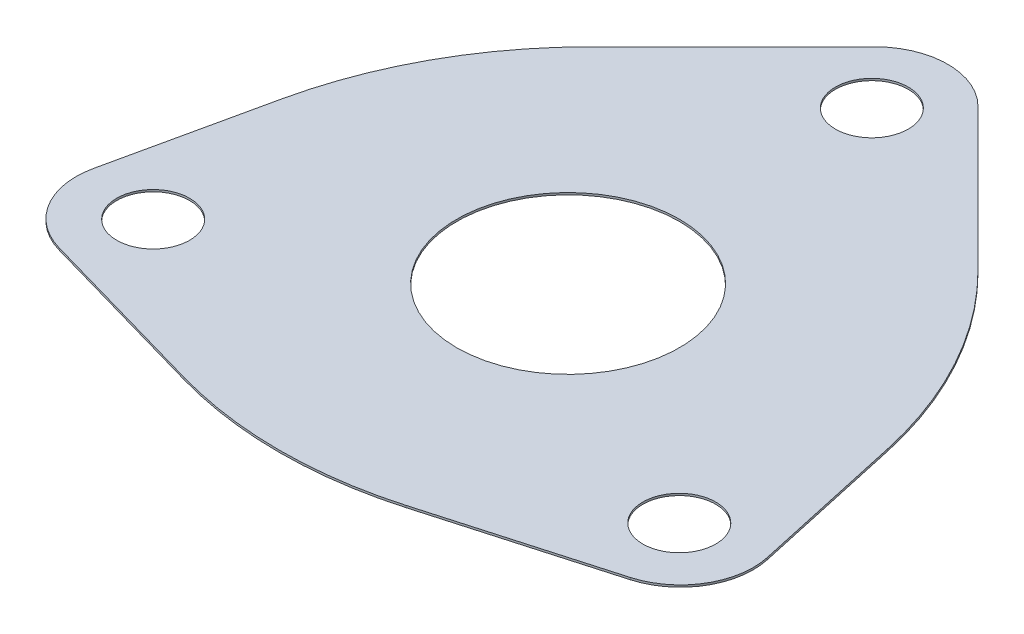
ISO-10303-21;
HEADER;
FILE_DESCRIPTION(('STEP AP214'),'2;1');
FILE_NAME('part.step','',(''),(''),'','','');
FILE_SCHEMA(('AUTOMOTIVE_DESIGN { 1 0 10303 214 1 1 1 1 }'));
ENDSEC;
DATA;
#1=APPLICATION_CONTEXT('core data for automotive mechanical design processes');
#2=APPLICATION_PROTOCOL_DEFINITION('international standard','automotive_design',2000,#1);
#3=PRODUCT_CONTEXT('',#1,'mechanical');
#4=PRODUCT('Part','Part','',(#3));
#5=PRODUCT_RELATED_PRODUCT_CATEGORY('part','',(#4));
#6=PRODUCT_DEFINITION_FORMATION('','',#4);
#7=PRODUCT_DEFINITION_CONTEXT('part definition',#1,'design');
#8=PRODUCT_DEFINITION('design','',#6,#7);
#9=PRODUCT_DEFINITION_SHAPE('','',#8);
#10=(LENGTH_UNIT() NAMED_UNIT(*) SI_UNIT(.MILLI.,.METRE.));
#11=(NAMED_UNIT(*) PLANE_ANGLE_UNIT() SI_UNIT($,.RADIAN.));
#12=(NAMED_UNIT(*) SI_UNIT($,.STERADIAN.) SOLID_ANGLE_UNIT());
#13=UNCERTAINTY_MEASURE_WITH_UNIT(LENGTH_MEASURE(1.E-05),#10,'distance_accuracy_value','');
#14=(GEOMETRIC_REPRESENTATION_CONTEXT(3) GLOBAL_UNCERTAINTY_ASSIGNED_CONTEXT((#13)) GLOBAL_UNIT_ASSIGNED_CONTEXT((#10,
#11,#12)) REPRESENTATION_CONTEXT('',''));
#15=CARTESIAN_POINT('',(0.,0.,0.));
#16=DIRECTION('',(0.,0.,1.));
#17=DIRECTION('',(1.,0.,0.));
#18=AXIS2_PLACEMENT_3D('',#15,#16,#17);
#19=CARTESIAN_POINT('',(0.,0.5,-75.7521943673232));
#20=DIRECTION('',(0.,1.,0.));
#21=DIRECTION('',(0.,0.,1.));
#22=AXIS2_PLACEMENT_3D('',#19,#20,#21);
#23=PLANE('',#22);
#24=CARTESIAN_POINT('',(0.,0.5,-75.));
#25=DIRECTION('',(0.,1.,0.));
#26=DIRECTION('',(0.,0.,1.));
#27=AXIS2_PLACEMENT_3D('',#24,#25,#26);
#28=CIRCLE('',#27,9.);
#29=CARTESIAN_POINT('',(0.,0.5,-66.));
#30=VERTEX_POINT('',#29);
#31=EDGE_CURVE('E298',#30,#30,#28,.T.);
#32=ORIENTED_EDGE('',*,*,#31,.F.);
#33=EDGE_LOOP('',(#32));
#34=FACE_BOUND('',#33,.T.);
#35=CARTESIAN_POINT('',(64.9519052838329,0.5,37.5));
#36=DIRECTION('',(0.,1.,0.));
#37=DIRECTION('',(0.,0.,1.));
#38=AXIS2_PLACEMENT_3D('',#35,#36,#37);
#39=CIRCLE('',#38,9.);
#40=CARTESIAN_POINT('',(64.9519052838329,0.5,46.5));
#41=VERTEX_POINT('',#40);
#42=EDGE_CURVE('E165',#41,#41,#39,.T.);
#43=ORIENTED_EDGE('',*,*,#42,.F.);
#44=EDGE_LOOP('',(#43));
#45=FACE_BOUND('',#44,.T.);
#46=CARTESIAN_POINT('',(0.,0.5,-75.7521943673232));
#47=DIRECTION('',(0.,1.,0.));
#48=DIRECTION('',(0.,0.,1.));
#49=AXIS2_PLACEMENT_3D('',#46,#47,#48);
#50=CIRCLE('',#49,18.);
#51=CARTESIAN_POINT('',(12.7279220613578,0.5,-88.4801164286811));
#52=VERTEX_POINT('',#51);
#53=CARTESIAN_POINT('',(-12.7279220613578,0.5,-88.4801164286811));
#54=VERTEX_POINT('',#53);
#55=EDGE_CURVE('E184',#52,#54,#50,.T.);
#56=ORIENTED_EDGE('',*,*,#55,.T.);
#57=DIRECTION('',(-0.707106781186548,0.,0.707106781186547));
#58=VECTOR('',#57,1.);
#59=CARTESIAN_POINT('',(-12.7279220613578,0.5,-88.4801164286811));
#60=LINE('',#59,#58);
#61=CARTESIAN_POINT('',(-47.8531523018058,0.5,-53.3548861882332));
#62=VERTEX_POINT('',#61);
#63=EDGE_CURVE('E112',#54,#62,#60,.T.);
#64=ORIENTED_EDGE('',*,*,#63,.T.);
#65=CARTESIAN_POINT('',(22.8575258168488,0.5,17.3557919304217));
#66=DIRECTION('',(0.,1.,0.));
#67=DIRECTION('',(0.,0.,-1.));
#68=AXIS2_PLACEMENT_3D('',#65,#66,#67);
#69=CIRCLE('',#68,100.);
#70=CARTESIAN_POINT('',(-74.8147469923264,0.5,-4.09478205467377));
#71=VERTEX_POINT('',#70);
#72=EDGE_CURVE('E211',#62,#71,#69,.T.);
#73=ORIENTED_EDGE('',*,*,#72,.T.);
#74=DIRECTION('',(-0.214505739850953,0.,0.976722728091752));
#75=VECTOR('',#74,1.);
#76=CARTESIAN_POINT('',(-83.1843338201699,0.5,34.0149938663444));
#77=LINE('',#76,#75);
#78=CARTESIAN_POINT('',(-83.1843338201699,0.5,34.0149938663444));
#79=VERTEX_POINT('',#78);
#80=EDGE_CURVE('E230',#71,#79,#77,.T.);
#81=ORIENTED_EDGE('',*,*,#80,.T.);
#82=CARTESIAN_POINT('',(-65.6033247145183,0.5,37.8760971836616));
#83=DIRECTION('',(0.,1.,0.));
#84=DIRECTION('',(0.,0.,1.));
#85=AXIS2_PLACEMENT_3D('',#82,#83,#84);
#86=CIRCLE('',#85,18.);
#87=CARTESIAN_POINT('',(-70.5339660250572,0.5,55.1876186727396));
#88=VERTEX_POINT('',#87);
#89=EDGE_CURVE('E227',#79,#88,#86,.T.);
#90=ORIENTED_EDGE('',*,*,#89,.T.);
#91=DIRECTION('',(0.961751193837663,0.,0.27392451725216));
#92=VECTOR('',#91,1.);
#93=CARTESIAN_POINT('',(-70.5339660250572,0.5,55.1876186727396));
#94=LINE('',#93,#92);
#95=CARTESIAN_POINT('',(-27.392451725216,0.5,67.4751193837664));
#96=VERTEX_POINT('',#95);
#97=EDGE_CURVE('E229',#88,#96,#94,.T.);
#98=ORIENTED_EDGE('',*,*,#97,.T.);
#99=CARTESIAN_POINT('',(0.,0.5,-28.7));
#100=DIRECTION('',(0.,1.,0.));
#101=DIRECTION('',(0.,0.,-1.));
#102=AXIS2_PLACEMENT_3D('',#99,#100,#101);
#103=CIRCLE('',#102,100.);
#104=CARTESIAN_POINT('',(27.392451725216,0.5,67.4751193837664));
#105=VERTEX_POINT('',#104);
#106=EDGE_CURVE('E232',#96,#105,#103,.T.);
#107=ORIENTED_EDGE('',*,*,#106,.T.);
#108=DIRECTION('',(0.961751193837663,0.,-0.27392451725216));
#109=VECTOR('',#108,1.);
#110=CARTESIAN_POINT('',(70.5339660250572,0.5,55.1876186727396));
#111=LINE('',#110,#109);
#112=CARTESIAN_POINT('',(70.5339660250572,0.5,55.1876186727396));
#113=VERTEX_POINT('',#112);
#114=EDGE_CURVE('E238',#105,#113,#111,.T.);
#115=ORIENTED_EDGE('',*,*,#114,.T.);
#116=CARTESIAN_POINT('',(65.6033247145183,0.5,37.8760971836616));
#117=DIRECTION('',(0.,1.,0.));
#118=DIRECTION('',(0.,0.,1.));
#119=AXIS2_PLACEMENT_3D('',#116,#117,#118);
#120=CIRCLE('',#119,18.);
#121=CARTESIAN_POINT('',(83.1843338201699,0.5,34.0149938663444));
#122=VERTEX_POINT('',#121);
#123=EDGE_CURVE('E143',#113,#122,#120,.T.);
#124=ORIENTED_EDGE('',*,*,#123,.T.);
#125=DIRECTION('',(-0.214505739850954,0.,-0.976722728091752));
#126=VECTOR('',#125,1.);
#127=CARTESIAN_POINT('',(83.1843338201699,0.5,34.0149938663444));
#128=LINE('',#127,#126);
#129=CARTESIAN_POINT('',(74.8147469923264,0.5,-4.09478205467376));
#130=VERTEX_POINT('',#129);
#131=EDGE_CURVE('E137',#122,#130,#128,.T.);
#132=ORIENTED_EDGE('',*,*,#131,.T.);
#133=CARTESIAN_POINT('',(-22.8575258168488,0.5,17.3557919304217));
#134=DIRECTION('',(0.,1.,0.));
#135=DIRECTION('',(0.,0.,1.));
#136=AXIS2_PLACEMENT_3D('',#133,#134,#135);
#137=CIRCLE('',#136,100.);
#138=CARTESIAN_POINT('',(47.8531523018058,0.5,-53.3548861882332));
#139=VERTEX_POINT('',#138);
#140=EDGE_CURVE('E141',#130,#139,#137,.T.);
#141=ORIENTED_EDGE('',*,*,#140,.T.);
#142=DIRECTION('',(-0.707106781186548,0.,-0.707106781186547));
#143=VECTOR('',#142,1.);
#144=CARTESIAN_POINT('',(12.7279220613578,0.5,-88.4801164286811));
#145=LINE('',#144,#143);
#146=EDGE_CURVE('E57',#139,#52,#145,.T.);
#147=ORIENTED_EDGE('',*,*,#146,.T.);
#148=EDGE_LOOP('',(#56,#64,#73,#81,#90,#98,#107,#115,#124,#132,#141,#147));
#149=FACE_BOUND('',#148,.T.);
#150=CARTESIAN_POINT('',(-64.9519052838329,0.5,37.5));
#151=DIRECTION('',(0.,1.,0.));
#152=DIRECTION('',(0.,0.,-1.));
#153=AXIS2_PLACEMENT_3D('',#150,#151,#152);
#154=CIRCLE('',#153,9.);
#155=CARTESIAN_POINT('',(-64.9519052838329,0.5,28.5));
#156=VERTEX_POINT('',#155);
#157=EDGE_CURVE('E304',#156,#156,#154,.T.);
#158=ORIENTED_EDGE('',*,*,#157,.F.);
#159=EDGE_LOOP('',(#158));
#160=FACE_BOUND('',#159,.T.);
#161=CARTESIAN_POINT('',(0.,0.5,0.));
#162=DIRECTION('',(0.,1.,0.));
#163=DIRECTION('',(0.,0.,1.));
#164=AXIS2_PLACEMENT_3D('',#161,#162,#163);
#165=CIRCLE('',#164,27.5);
#166=CARTESIAN_POINT('',(0.,0.5,27.5));
#167=VERTEX_POINT('',#166);
#168=EDGE_CURVE('E289',#167,#167,#165,.T.);
#169=ORIENTED_EDGE('',*,*,#168,.F.);
#170=EDGE_LOOP('',(#169));
#171=FACE_BOUND('',#170,.T.);
#172=ADVANCED_FACE('F40',(#34,#45,#149,#160,#171),#23,.T.);
#173=CARTESIAN_POINT('',(0.,0.,-75.7521943673232));
#174=DIRECTION('',(0.,1.,0.));
#175=DIRECTION('',(0.,0.,1.));
#176=AXIS2_PLACEMENT_3D('',#173,#174,#175);
#177=PLANE('',#176);
#178=CARTESIAN_POINT('',(0.,0.,-75.7521943673232));
#179=DIRECTION('',(0.,1.,0.));
#180=DIRECTION('',(0.,0.,1.));
#181=AXIS2_PLACEMENT_3D('',#178,#179,#180);
#182=CIRCLE('',#181,18.);
#183=CARTESIAN_POINT('',(12.7279220613578,0.,-88.4801164286811));
#184=VERTEX_POINT('',#183);
#185=CARTESIAN_POINT('',(-12.7279220613578,0.,-88.4801164286811));
#186=VERTEX_POINT('',#185);
#187=EDGE_CURVE('E161',#184,#186,#182,.T.);
#188=ORIENTED_EDGE('',*,*,#187,.F.);
#189=DIRECTION('',(-0.707106781186548,0.,-0.707106781186547));
#190=VECTOR('',#189,1.);
#191=CARTESIAN_POINT('',(12.7279220613578,0.,-88.4801164286811));
#192=LINE('',#191,#190);
#193=CARTESIAN_POINT('',(47.8531523018058,0.,-53.3548861882332));
#194=VERTEX_POINT('',#193);
#195=EDGE_CURVE('E104',#194,#184,#192,.T.);
#196=ORIENTED_EDGE('',*,*,#195,.F.);
#197=CARTESIAN_POINT('',(-22.8575258168488,0.,17.3557919304217));
#198=DIRECTION('',(0.,1.,0.));
#199=DIRECTION('',(0.,0.,1.));
#200=AXIS2_PLACEMENT_3D('',#197,#198,#199);
#201=CIRCLE('',#200,100.);
#202=CARTESIAN_POINT('',(74.8147469923264,0.,-4.09478205467376));
#203=VERTEX_POINT('',#202);
#204=EDGE_CURVE('E98',#203,#194,#201,.T.);
#205=ORIENTED_EDGE('',*,*,#204,.F.);
#206=DIRECTION('',(-0.214505739850954,0.,-0.976722728091752));
#207=VECTOR('',#206,1.);
#208=CARTESIAN_POINT('',(83.1843338201699,0.,34.0149938663444));
#209=LINE('',#208,#207);
#210=CARTESIAN_POINT('',(83.1843338201699,0.,34.0149938663444));
#211=VERTEX_POINT('',#210);
#212=EDGE_CURVE('E151',#211,#203,#209,.T.);
#213=ORIENTED_EDGE('',*,*,#212,.F.);
#214=CARTESIAN_POINT('',(65.6033247145183,0.,37.8760971836616));
#215=DIRECTION('',(0.,1.,0.));
#216=DIRECTION('',(0.,0.,1.));
#217=AXIS2_PLACEMENT_3D('',#214,#215,#216);
#218=CIRCLE('',#217,18.);
#219=CARTESIAN_POINT('',(70.5339660250572,0.,55.1876186727396));
#220=VERTEX_POINT('',#219);
#221=EDGE_CURVE('E179',#220,#211,#218,.T.);
#222=ORIENTED_EDGE('',*,*,#221,.F.);
#223=DIRECTION('',(0.961751193837663,0.,-0.27392451725216));
#224=VECTOR('',#223,1.);
#225=CARTESIAN_POINT('',(70.5339660250572,0.,55.1876186727396));
#226=LINE('',#225,#224);
#227=CARTESIAN_POINT('',(27.392451725216,0.,67.4751193837664));
#228=VERTEX_POINT('',#227);
#229=EDGE_CURVE('E177',#228,#220,#226,.T.);
#230=ORIENTED_EDGE('',*,*,#229,.F.);
#231=CARTESIAN_POINT('',(0.,0.,-28.7));
#232=DIRECTION('',(0.,1.,0.));
#233=DIRECTION('',(0.,0.,-1.));
#234=AXIS2_PLACEMENT_3D('',#231,#232,#233);
#235=CIRCLE('',#234,100.);
#236=CARTESIAN_POINT('',(-27.392451725216,0.,67.4751193837664));
#237=VERTEX_POINT('',#236);
#238=EDGE_CURVE('E175',#237,#228,#235,.T.);
#239=ORIENTED_EDGE('',*,*,#238,.F.);
#240=DIRECTION('',(0.961751193837663,0.,0.27392451725216));
#241=VECTOR('',#240,1.);
#242=CARTESIAN_POINT('',(-70.5339660250572,0.,55.1876186727396));
#243=LINE('',#242,#241);
#244=CARTESIAN_POINT('',(-70.5339660250572,0.,55.1876186727396));
#245=VERTEX_POINT('',#244);
#246=EDGE_CURVE('E173',#245,#237,#243,.T.);
#247=ORIENTED_EDGE('',*,*,#246,.F.);
#248=CARTESIAN_POINT('',(-65.6033247145183,0.,37.8760971836616));
#249=DIRECTION('',(0.,1.,0.));
#250=DIRECTION('',(0.,0.,1.));
#251=AXIS2_PLACEMENT_3D('',#248,#249,#250);
#252=CIRCLE('',#251,18.);
#253=CARTESIAN_POINT('',(-83.1843338201699,0.,34.0149938663444));
#254=VERTEX_POINT('',#253);
#255=EDGE_CURVE('E171',#254,#245,#252,.T.);
#256=ORIENTED_EDGE('',*,*,#255,.F.);
#257=DIRECTION('',(-0.214505739850953,0.,0.976722728091752));
#258=VECTOR('',#257,1.);
#259=CARTESIAN_POINT('',(-83.1843338201699,0.,34.0149938663444));
#260=LINE('',#259,#258);
#261=CARTESIAN_POINT('',(-74.8147469923264,0.,-4.09478205467377));
#262=VERTEX_POINT('',#261);
#263=EDGE_CURVE('E169',#262,#254,#260,.T.);
#264=ORIENTED_EDGE('',*,*,#263,.F.);
#265=CARTESIAN_POINT('',(22.8575258168488,0.,17.3557919304217));
#266=DIRECTION('',(0.,1.,0.));
#267=DIRECTION('',(0.,0.,-1.));
#268=AXIS2_PLACEMENT_3D('',#265,#266,#267);
#269=CIRCLE('',#268,100.);
#270=CARTESIAN_POINT('',(-47.8531523018058,0.,-53.3548861882332));
#271=VERTEX_POINT('',#270);
#272=EDGE_CURVE('E167',#271,#262,#269,.T.);
#273=ORIENTED_EDGE('',*,*,#272,.F.);
#274=DIRECTION('',(-0.707106781186548,0.,0.707106781186547));
#275=VECTOR('',#274,1.);
#276=CARTESIAN_POINT('',(-12.7279220613578,0.,-88.4801164286811));
#277=LINE('',#276,#275);
#278=EDGE_CURVE('E164',#186,#271,#277,.T.);
#279=ORIENTED_EDGE('',*,*,#278,.F.);
#280=EDGE_LOOP('',(#188,#196,#205,#213,#222,#230,#239,#247,#256,#264,#273,#279));
#281=FACE_BOUND('',#280,.T.);
#282=CARTESIAN_POINT('',(64.9519052838329,0.,37.5));
#283=DIRECTION('',(0.,1.,0.));
#284=DIRECTION('',(0.,0.,1.));
#285=AXIS2_PLACEMENT_3D('',#282,#283,#284);
#286=CIRCLE('',#285,9.);
#287=CARTESIAN_POINT('',(64.9519052838329,0.,46.5));
#288=VERTEX_POINT('',#287);
#289=EDGE_CURVE('E307',#288,#288,#286,.T.);
#290=ORIENTED_EDGE('',*,*,#289,.T.);
#291=EDGE_LOOP('',(#290));
#292=FACE_BOUND('',#291,.T.);
#293=CARTESIAN_POINT('',(-64.9519052838329,0.,37.5));
#294=DIRECTION('',(0.,1.,0.));
#295=DIRECTION('',(0.,0.,-1.));
#296=AXIS2_PLACEMENT_3D('',#293,#294,#295);
#297=CIRCLE('',#296,9.);
#298=CARTESIAN_POINT('',(-64.9519052838329,0.,28.5));
#299=VERTEX_POINT('',#298);
#300=EDGE_CURVE('E301',#299,#299,#297,.T.);
#301=ORIENTED_EDGE('',*,*,#300,.T.);
#302=EDGE_LOOP('',(#301));
#303=FACE_BOUND('',#302,.T.);
#304=CARTESIAN_POINT('',(0.,0.,-75.));
#305=DIRECTION('',(0.,1.,0.));
#306=DIRECTION('',(0.,0.,1.));
#307=AXIS2_PLACEMENT_3D('',#304,#305,#306);
#308=CIRCLE('',#307,9.);
#309=CARTESIAN_POINT('',(0.,0.,-66.));
#310=VERTEX_POINT('',#309);
#311=EDGE_CURVE('E295',#310,#310,#308,.T.);
#312=ORIENTED_EDGE('',*,*,#311,.T.);
#313=EDGE_LOOP('',(#312));
#314=FACE_BOUND('',#313,.T.);
#315=CARTESIAN_POINT('',(0.,0.,0.));
#316=DIRECTION('',(0.,1.,0.));
#317=DIRECTION('',(0.,0.,1.));
#318=AXIS2_PLACEMENT_3D('',#315,#316,#317);
#319=CIRCLE('',#318,27.5);
#320=CARTESIAN_POINT('',(0.,0.,27.5));
#321=VERTEX_POINT('',#320);
#322=EDGE_CURVE('E292',#321,#321,#319,.T.);
#323=ORIENTED_EDGE('',*,*,#322,.T.);
#324=EDGE_LOOP('',(#323));
#325=FACE_BOUND('',#324,.T.);
#326=ADVANCED_FACE('F215',(#281,#292,#303,#314,#325),#177,.F.);
#327=CARTESIAN_POINT('',(0.,0.5,-75.7521943673232));
#328=DIRECTION('',(0.,-1.,0.));
#329=DIRECTION('',(0.,0.,-1.));
#330=AXIS2_PLACEMENT_3D('',#327,#328,#329);
#331=CYLINDRICAL_SURFACE('',#330,18.);
#332=ORIENTED_EDGE('',*,*,#187,.T.);
#333=DIRECTION('',(0.,-1.,0.));
#334=VECTOR('',#333,1.);
#335=CARTESIAN_POINT('',(-12.7279220613578,0.5,-88.4801164286811));
#336=LINE('',#335,#334);
#337=EDGE_CURVE('E11',#54,#186,#336,.T.);
#338=ORIENTED_EDGE('',*,*,#337,.F.);
#339=ORIENTED_EDGE('',*,*,#55,.F.);
#340=DIRECTION('',(0.,-1.,0.));
#341=VECTOR('',#340,1.);
#342=CARTESIAN_POINT('',(12.7279220613578,0.5,-88.4801164286811));
#343=LINE('',#342,#341);
#344=EDGE_CURVE('E157',#52,#184,#343,.T.);
#345=ORIENTED_EDGE('',*,*,#344,.T.);
#346=EDGE_LOOP('',(#332,#338,#339,#345));
#347=FACE_BOUND('',#346,.T.);
#348=ADVANCED_FACE('F42',(#347),#331,.T.);
#349=CARTESIAN_POINT('',(-12.7279220613578,0.5,-88.4801164286811));
#350=DIRECTION('',(0.707106781186547,0.,0.707106781186548));
#351=DIRECTION('',(0.707106781186548,0.,-0.707106781186547));
#352=AXIS2_PLACEMENT_3D('',#349,#350,#351);
#353=PLANE('',#352);
#354=ORIENTED_EDGE('',*,*,#278,.T.);
#355=DIRECTION('',(0.,-1.,0.));
#356=VECTOR('',#355,1.);
#357=CARTESIAN_POINT('',(-47.8531523018058,0.5,-53.3548861882332));
#358=LINE('',#357,#356);
#359=EDGE_CURVE('E49',#62,#271,#358,.T.);
#360=ORIENTED_EDGE('',*,*,#359,.F.);
#361=ORIENTED_EDGE('',*,*,#63,.F.);
#362=ORIENTED_EDGE('',*,*,#337,.T.);
#363=EDGE_LOOP('',(#354,#360,#361,#362));
#364=FACE_BOUND('',#363,.T.);
#365=ADVANCED_FACE('F421',(#364),#353,.F.);
#366=CARTESIAN_POINT('',(22.8575258168488,0.5,17.3557919304217));
#367=DIRECTION('',(0.,-1.,0.));
#368=DIRECTION('',(0.,0.,-1.));
#369=AXIS2_PLACEMENT_3D('',#366,#367,#368);
#370=CYLINDRICAL_SURFACE('',#369,100.);
#371=ORIENTED_EDGE('',*,*,#272,.T.);
#372=DIRECTION('',(0.,-1.,0.));
#373=VECTOR('',#372,1.);
#374=CARTESIAN_POINT('',(-74.8147469923264,0.5,-4.09478205467377));
#375=LINE('',#374,#373);
#376=EDGE_CURVE('E203',#71,#262,#375,.T.);
#377=ORIENTED_EDGE('',*,*,#376,.F.);
#378=ORIENTED_EDGE('',*,*,#72,.F.);
#379=ORIENTED_EDGE('',*,*,#359,.T.);
#380=EDGE_LOOP('',(#371,#377,#378,#379));
#381=FACE_BOUND('',#380,.T.);
#382=ADVANCED_FACE('F209',(#381),#370,.T.);
#383=CARTESIAN_POINT('',(-83.1843338201699,0.5,34.0149938663444));
#384=DIRECTION('',(0.976722728091752,0.,0.214505739850953));
#385=DIRECTION('',(0.214505739850953,0.,-0.976722728091752));
#386=AXIS2_PLACEMENT_3D('',#383,#384,#385);
#387=PLANE('',#386);
#388=ORIENTED_EDGE('',*,*,#263,.T.);
#389=DIRECTION('',(0.,-1.,0.));
#390=VECTOR('',#389,1.);
#391=CARTESIAN_POINT('',(-83.1843338201699,0.5,34.0149938663444));
#392=LINE('',#391,#390);
#393=EDGE_CURVE('E200',#79,#254,#392,.T.);
#394=ORIENTED_EDGE('',*,*,#393,.F.);
#395=ORIENTED_EDGE('',*,*,#80,.F.);
#396=ORIENTED_EDGE('',*,*,#376,.T.);
#397=EDGE_LOOP('',(#388,#394,#395,#396));
#398=FACE_BOUND('',#397,.T.);
#399=ADVANCED_FACE('F221',(#398),#387,.F.);
#400=CARTESIAN_POINT('',(-65.6033247145183,0.5,37.8760971836616));
#401=DIRECTION('',(0.,-1.,0.));
#402=DIRECTION('',(0.,0.,-1.));
#403=AXIS2_PLACEMENT_3D('',#400,#401,#402);
#404=CYLINDRICAL_SURFACE('',#403,18.);
#405=ORIENTED_EDGE('',*,*,#255,.T.);
#406=DIRECTION('',(0.,-1.,0.));
#407=VECTOR('',#406,1.);
#408=CARTESIAN_POINT('',(-70.5339660250572,0.5,55.1876186727396));
#409=LINE('',#408,#407);
#410=EDGE_CURVE('E197',#88,#245,#409,.T.);
#411=ORIENTED_EDGE('',*,*,#410,.F.);
#412=ORIENTED_EDGE('',*,*,#89,.F.);
#413=ORIENTED_EDGE('',*,*,#393,.T.);
#414=EDGE_LOOP('',(#405,#411,#412,#413));
#415=FACE_BOUND('',#414,.T.);
#416=ADVANCED_FACE('F225',(#415),#404,.T.);
#417=CARTESIAN_POINT('',(-70.5339660250572,0.5,55.1876186727396));
#418=DIRECTION('',(0.27392451725216,0.,-0.961751193837663));
#419=DIRECTION('',(-0.961751193837663,0.,-0.27392451725216));
#420=AXIS2_PLACEMENT_3D('',#417,#418,#419);
#421=PLANE('',#420);
#422=ORIENTED_EDGE('',*,*,#246,.T.);
#423=DIRECTION('',(0.,-1.,0.));
#424=VECTOR('',#423,1.);
#425=CARTESIAN_POINT('',(-27.392451725216,0.5,67.4751193837664));
#426=LINE('',#425,#424);
#427=EDGE_CURVE('E194',#96,#237,#426,.T.);
#428=ORIENTED_EDGE('',*,*,#427,.F.);
#429=ORIENTED_EDGE('',*,*,#97,.F.);
#430=ORIENTED_EDGE('',*,*,#410,.T.);
#431=EDGE_LOOP('',(#422,#428,#429,#430));
#432=FACE_BOUND('',#431,.T.);
#433=ADVANCED_FACE('F386',(#432),#421,.F.);
#434=CARTESIAN_POINT('',(0.,0.5,-28.7));
#435=DIRECTION('',(0.,-1.,0.));
#436=DIRECTION('',(0.,0.,-1.));
#437=AXIS2_PLACEMENT_3D('',#434,#435,#436);
#438=CYLINDRICAL_SURFACE('',#437,100.);
#439=ORIENTED_EDGE('',*,*,#238,.T.);
#440=DIRECTION('',(0.,-1.,0.));
#441=VECTOR('',#440,1.);
#442=CARTESIAN_POINT('',(27.392451725216,0.5,67.4751193837664));
#443=LINE('',#442,#441);
#444=EDGE_CURVE('E191',#105,#228,#443,.T.);
#445=ORIENTED_EDGE('',*,*,#444,.F.);
#446=ORIENTED_EDGE('',*,*,#106,.F.);
#447=ORIENTED_EDGE('',*,*,#427,.T.);
#448=EDGE_LOOP('',(#439,#445,#446,#447));
#449=FACE_BOUND('',#448,.T.);
#450=ADVANCED_FACE('F377',(#449),#438,.T.);
#451=CARTESIAN_POINT('',(70.5339660250572,0.5,55.1876186727396));
#452=DIRECTION('',(-0.27392451725216,0.,-0.961751193837663));
#453=DIRECTION('',(-0.961751193837663,0.,0.27392451725216));
#454=AXIS2_PLACEMENT_3D('',#451,#452,#453);
#455=PLANE('',#454);
#456=ORIENTED_EDGE('',*,*,#229,.T.);
#457=DIRECTION('',(0.,-1.,0.));
#458=VECTOR('',#457,1.);
#459=CARTESIAN_POINT('',(70.5339660250572,0.5,55.1876186727396));
#460=LINE('',#459,#458);
#461=EDGE_CURVE('E188',#113,#220,#460,.T.);
#462=ORIENTED_EDGE('',*,*,#461,.F.);
#463=ORIENTED_EDGE('',*,*,#114,.F.);
#464=ORIENTED_EDGE('',*,*,#444,.T.);
#465=EDGE_LOOP('',(#456,#462,#463,#464));
#466=FACE_BOUND('',#465,.T.);
#467=ADVANCED_FACE('F244',(#466),#455,.F.);
#468=CARTESIAN_POINT('',(65.6033247145183,0.5,37.8760971836616));
#469=DIRECTION('',(0.,-1.,0.));
#470=DIRECTION('',(0.,0.,-1.));
#471=AXIS2_PLACEMENT_3D('',#468,#469,#470);
#472=CYLINDRICAL_SURFACE('',#471,18.);
#473=ORIENTED_EDGE('',*,*,#221,.T.);
#474=DIRECTION('',(0.,-1.,0.));
#475=VECTOR('',#474,1.);
#476=CARTESIAN_POINT('',(83.1843338201699,0.5,34.0149938663444));
#477=LINE('',#476,#475);
#478=EDGE_CURVE('E152',#122,#211,#477,.T.);
#479=ORIENTED_EDGE('',*,*,#478,.F.);
#480=ORIENTED_EDGE('',*,*,#123,.F.);
#481=ORIENTED_EDGE('',*,*,#461,.T.);
#482=EDGE_LOOP('',(#473,#479,#480,#481));
#483=FACE_BOUND('',#482,.T.);
#484=ADVANCED_FACE('F248',(#483),#472,.T.);
#485=CARTESIAN_POINT('',(83.1843338201699,0.5,34.0149938663444));
#486=DIRECTION('',(-0.976722728091752,0.,0.214505739850954));
#487=DIRECTION('',(0.214505739850954,0.,0.976722728091752));
#488=AXIS2_PLACEMENT_3D('',#485,#486,#487);
#489=PLANE('',#488);
#490=ORIENTED_EDGE('',*,*,#212,.T.);
#491=DIRECTION('',(0.,-1.,0.));
#492=VECTOR('',#491,1.);
#493=CARTESIAN_POINT('',(74.8147469923264,0.5,-4.09478205467376));
#494=LINE('',#493,#492);
#495=EDGE_CURVE('E148',#130,#203,#494,.T.);
#496=ORIENTED_EDGE('',*,*,#495,.F.);
#497=ORIENTED_EDGE('',*,*,#131,.F.);
#498=ORIENTED_EDGE('',*,*,#478,.T.);
#499=EDGE_LOOP('',(#490,#496,#497,#498));
#500=FACE_BOUND('',#499,.T.);
#501=ADVANCED_FACE('F149',(#500),#489,.F.);
#502=CARTESIAN_POINT('',(-22.8575258168488,0.5,17.3557919304217));
#503=DIRECTION('',(0.,-1.,0.));
#504=DIRECTION('',(0.,0.,-1.));
#505=AXIS2_PLACEMENT_3D('',#502,#503,#504);
#506=CYLINDRICAL_SURFACE('',#505,100.);
#507=ORIENTED_EDGE('',*,*,#204,.T.);
#508=DIRECTION('',(0.,-1.,0.));
#509=VECTOR('',#508,1.);
#510=CARTESIAN_POINT('',(47.8531523018058,0.5,-53.3548861882332));
#511=LINE('',#510,#509);
#512=EDGE_CURVE('E153',#139,#194,#511,.T.);
#513=ORIENTED_EDGE('',*,*,#512,.F.);
#514=ORIENTED_EDGE('',*,*,#140,.F.);
#515=ORIENTED_EDGE('',*,*,#495,.T.);
#516=EDGE_LOOP('',(#507,#513,#514,#515));
#517=FACE_BOUND('',#516,.T.);
#518=ADVANCED_FACE('F155',(#517),#506,.T.);
#519=CARTESIAN_POINT('',(12.7279220613578,0.5,-88.4801164286811));
#520=DIRECTION('',(-0.707106781186547,0.,0.707106781186548));
#521=DIRECTION('',(0.707106781186548,0.,0.707106781186547));
#522=AXIS2_PLACEMENT_3D('',#519,#520,#521);
#523=PLANE('',#522);
#524=ORIENTED_EDGE('',*,*,#195,.T.);
#525=ORIENTED_EDGE('',*,*,#344,.F.);
#526=ORIENTED_EDGE('',*,*,#146,.F.);
#527=ORIENTED_EDGE('',*,*,#512,.T.);
#528=EDGE_LOOP('',(#524,#525,#526,#527));
#529=FACE_BOUND('',#528,.T.);
#530=ADVANCED_FACE('F252',(#529),#523,.F.);
#531=CARTESIAN_POINT('',(64.9519052838329,0.5,37.5));
#532=DIRECTION('',(0.,-1.,0.));
#533=DIRECTION('',(0.,0.,-1.));
#534=AXIS2_PLACEMENT_3D('',#531,#532,#533);
#535=CYLINDRICAL_SURFACE('',#534,9.);
#536=ORIENTED_EDGE('',*,*,#42,.T.);
#537=EDGE_LOOP('',(#536));
#538=FACE_BOUND('',#537,.T.);
#539=ORIENTED_EDGE('',*,*,#289,.F.);
#540=EDGE_LOOP('',(#539));
#541=FACE_BOUND('',#540,.T.);
#542=ADVANCED_FACE('F254',(#538,#541),#535,.F.);
#543=CARTESIAN_POINT('',(-64.9519052838329,0.5,37.5));
#544=DIRECTION('',(0.,-1.,0.));
#545=DIRECTION('',(0.,0.,-1.));
#546=AXIS2_PLACEMENT_3D('',#543,#544,#545);
#547=CYLINDRICAL_SURFACE('',#546,9.);
#548=ORIENTED_EDGE('',*,*,#157,.T.);
#549=EDGE_LOOP('',(#548));
#550=FACE_BOUND('',#549,.T.);
#551=ORIENTED_EDGE('',*,*,#300,.F.);
#552=EDGE_LOOP('',(#551));
#553=FACE_BOUND('',#552,.T.);
#554=ADVANCED_FACE('F260',(#550,#553),#547,.F.);
#555=CARTESIAN_POINT('',(0.,0.5,-75.));
#556=DIRECTION('',(0.,-1.,0.));
#557=DIRECTION('',(0.,0.,-1.));
#558=AXIS2_PLACEMENT_3D('',#555,#556,#557);
#559=CYLINDRICAL_SURFACE('',#558,9.);
#560=ORIENTED_EDGE('',*,*,#31,.T.);
#561=EDGE_LOOP('',(#560));
#562=FACE_BOUND('',#561,.T.);
#563=ORIENTED_EDGE('',*,*,#311,.F.);
#564=EDGE_LOOP('',(#563));
#565=FACE_BOUND('',#564,.T.);
#566=ADVANCED_FACE('F276',(#562,#565),#559,.F.);
#567=CARTESIAN_POINT('',(0.,0.5,0.));
#568=DIRECTION('',(0.,-1.,0.));
#569=DIRECTION('',(0.,0.,-1.));
#570=AXIS2_PLACEMENT_3D('',#567,#568,#569);
#571=CYLINDRICAL_SURFACE('',#570,27.5);
#572=ORIENTED_EDGE('',*,*,#168,.T.);
#573=EDGE_LOOP('',(#572));
#574=FACE_BOUND('',#573,.T.);
#575=ORIENTED_EDGE('',*,*,#322,.F.);
#576=EDGE_LOOP('',(#575));
#577=FACE_BOUND('',#576,.T.);
#578=ADVANCED_FACE('F280',(#574,#577),#571,.F.);
#579=CLOSED_SHELL('',(#172,#326,#348,#365,#382,#399,#416,#433,#450,#467,#484,#501,#518,#530,
#542,#554,#566,#578));
#580=MANIFOLD_SOLID_BREP('B2',#579);
#581=ADVANCED_BREP_SHAPE_REPRESENTATION('',(#18,#580),#14);
#582=SHAPE_DEFINITION_REPRESENTATION(#9,#581);
ENDSEC;
END-ISO-10303-21;
